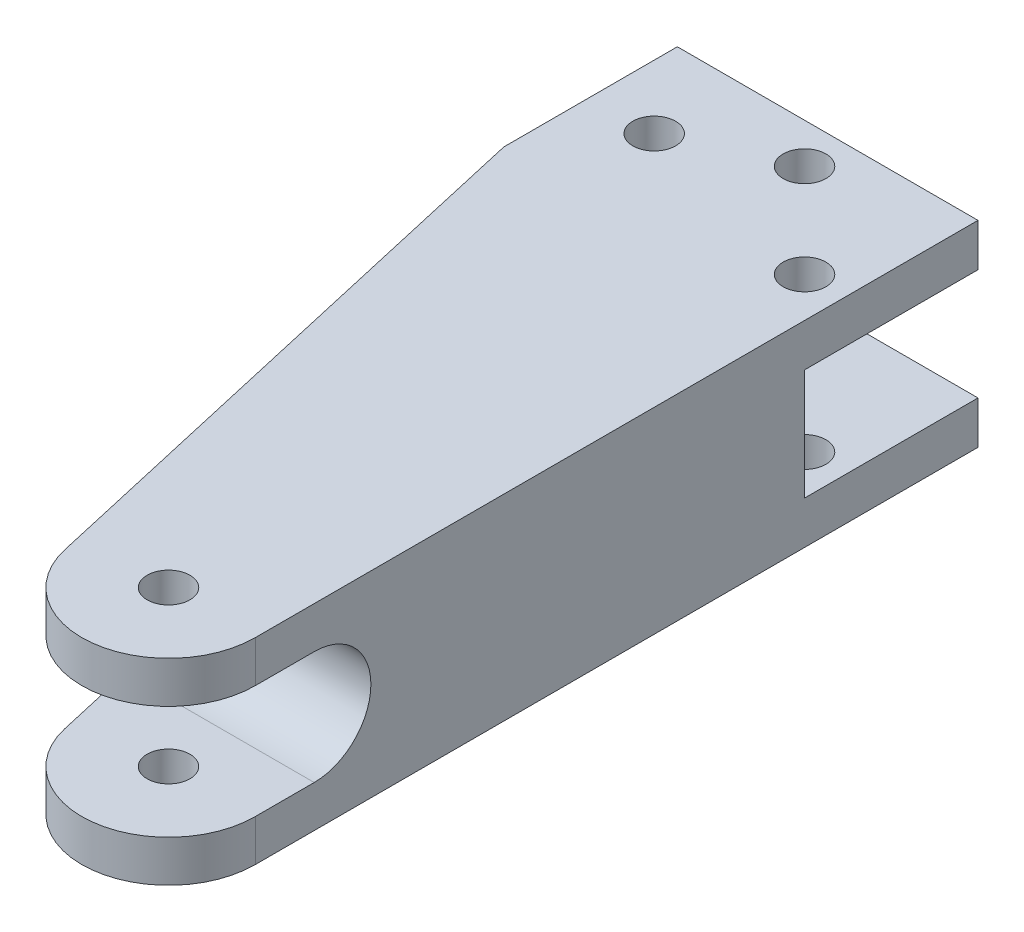
ISO-10303-21;
HEADER;
FILE_DESCRIPTION(('STEP AP214'),'2;1');
FILE_NAME('part.step','',(''),(''),'','','');
FILE_SCHEMA(('AUTOMOTIVE_DESIGN { 1 0 10303 214 1 1 1 1 }'));
ENDSEC;
DATA;
#1=APPLICATION_CONTEXT('core data for automotive mechanical design processes');
#2=APPLICATION_PROTOCOL_DEFINITION('international standard','automotive_design',2000,#1);
#3=PRODUCT_CONTEXT('',#1,'mechanical');
#4=PRODUCT('Part','Part','',(#3));
#5=PRODUCT_RELATED_PRODUCT_CATEGORY('part','',(#4));
#6=PRODUCT_DEFINITION_FORMATION('','',#4);
#7=PRODUCT_DEFINITION_CONTEXT('part definition',#1,'design');
#8=PRODUCT_DEFINITION('design','',#6,#7);
#9=PRODUCT_DEFINITION_SHAPE('','',#8);
#10=(LENGTH_UNIT() NAMED_UNIT(*) SI_UNIT(.MILLI.,.METRE.));
#11=(NAMED_UNIT(*) PLANE_ANGLE_UNIT() SI_UNIT($,.RADIAN.));
#12=(NAMED_UNIT(*) SI_UNIT($,.STERADIAN.) SOLID_ANGLE_UNIT());
#13=UNCERTAINTY_MEASURE_WITH_UNIT(LENGTH_MEASURE(1.E-05),#10,'distance_accuracy_value','');
#14=(GEOMETRIC_REPRESENTATION_CONTEXT(3) GLOBAL_UNCERTAINTY_ASSIGNED_CONTEXT((#13)) GLOBAL_UNIT_ASSIGNED_CONTEXT((#10,
#11,#12)) REPRESENTATION_CONTEXT('',''));
#15=CARTESIAN_POINT('',(0.,0.,0.));
#16=DIRECTION('',(0.,0.,1.));
#17=DIRECTION('',(1.,0.,0.));
#18=AXIS2_PLACEMENT_3D('',#15,#16,#17);
#19=CARTESIAN_POINT('',(0.,-78.105,79.375));
#20=DIRECTION('',(0.,1.,0.));
#21=DIRECTION('',(0.,0.,1.));
#22=AXIS2_PLACEMENT_3D('',#19,#20,#21);
#23=CYLINDRICAL_SURFACE('',#22,9.525);
#24=CARTESIAN_POINT('',(0.,-6.22300000000001,79.375));
#25=DIRECTION('',(0.,-1.,0.));
#26=DIRECTION('',(1.,0.,0.));
#27=AXIS2_PLACEMENT_3D('',#24,#25,#26);
#28=CIRCLE('',#27,9.525);
#29=CARTESIAN_POINT('',(-9.28759773629428,-6.223,81.4883275393988));
#30=VERTEX_POINT('',#29);
#31=CARTESIAN_POINT('',(9.525,-6.223,79.375));
#32=VERTEX_POINT('',#31);
#33=EDGE_CURVE('E184',#30,#32,#28,.F.);
#34=ORIENTED_EDGE('',*,*,#33,.F.);
#35=DIRECTION('',(0.,1.,0.));
#36=VECTOR('',#35,1.);
#37=CARTESIAN_POINT('',(-9.28759773629429,-93.5125785685914,81.4883275393988));
#38=LINE('',#37,#36);
#39=CARTESIAN_POINT('',(-9.28759773629429,-10.795,81.4883275393988));
#40=VERTEX_POINT('',#39);
#41=EDGE_CURVE('E214',#40,#30,#38,.T.);
#42=ORIENTED_EDGE('',*,*,#41,.F.);
#43=CARTESIAN_POINT('',(0.,-10.795,79.375));
#44=DIRECTION('',(0.,1.,0.));
#45=DIRECTION('',(0.,0.,1.));
#46=AXIS2_PLACEMENT_3D('',#43,#44,#45);
#47=CIRCLE('',#46,9.525);
#48=CARTESIAN_POINT('',(9.525,-10.795,79.375));
#49=VERTEX_POINT('',#48);
#50=EDGE_CURVE('E256',#40,#49,#47,.T.);
#51=ORIENTED_EDGE('',*,*,#50,.T.);
#52=DIRECTION('',(0.,1.,0.));
#53=VECTOR('',#52,1.);
#54=CARTESIAN_POINT('',(9.525,-78.105,79.375));
#55=LINE('',#54,#53);
#56=EDGE_CURVE('E253',#49,#32,#55,.T.);
#57=ORIENTED_EDGE('',*,*,#56,.T.);
#58=EDGE_LOOP('',(#34,#42,#51,#57));
#59=FACE_BOUND('',#58,.T.);
#60=ADVANCED_FACE('F39',(#59),#23,.T.);
#61=CARTESIAN_POINT('',(0.,0.,0.));
#62=DIRECTION('',(0.,0.,-1.));
#63=DIRECTION('',(-1.,0.,0.));
#64=AXIS2_PLACEMENT_3D('',#61,#62,#63);
#65=PLANE('',#64);
#66=DIRECTION('',(-1.,0.,0.));
#67=VECTOR('',#66,1.);
#68=CARTESIAN_POINT('',(0.,-6.096,0.));
#69=LINE('',#68,#67);
#70=CARTESIAN_POINT('',(9.525,-6.096,0.));
#71=VERTEX_POINT('',#70);
#72=CARTESIAN_POINT('',(-23.495,-6.096,0.));
#73=VERTEX_POINT('',#72);
#74=EDGE_CURVE('E204',#71,#73,#69,.T.);
#75=ORIENTED_EDGE('',*,*,#74,.F.);
#76=DIRECTION('',(0.,1.,0.));
#77=VECTOR('',#76,1.);
#78=CARTESIAN_POINT('',(9.525,-10.795,0.));
#79=LINE('',#78,#77);
#80=CARTESIAN_POINT('',(9.525,-10.795,0.));
#81=VERTEX_POINT('',#80);
#82=EDGE_CURVE('E262',#81,#71,#79,.T.);
#83=ORIENTED_EDGE('',*,*,#82,.F.);
#84=DIRECTION('',(1.,0.,0.));
#85=VECTOR('',#84,1.);
#86=CARTESIAN_POINT('',(-9.525,-10.795,0.));
#87=LINE('',#86,#85);
#88=CARTESIAN_POINT('',(-23.495,-10.795,0.));
#89=VERTEX_POINT('',#88);
#90=EDGE_CURVE('E258',#89,#81,#87,.T.);
#91=ORIENTED_EDGE('',*,*,#90,.F.);
#92=DIRECTION('',(0.,1.,0.));
#93=VECTOR('',#92,1.);
#94=CARTESIAN_POINT('',(-23.495,-93.5125785685914,0.));
#95=LINE('',#94,#93);
#96=EDGE_CURVE('E222',#89,#73,#95,.T.);
#97=ORIENTED_EDGE('',*,*,#96,.T.);
#98=EDGE_LOOP('',(#75,#83,#91,#97));
#99=FACE_BOUND('',#98,.T.);
#100=ADVANCED_FACE('F327',(#99),#65,.T.);
#101=CARTESIAN_POINT('',(-5.1435,-10.795,4.3815));
#102=DIRECTION('',(0.,1.,0.));
#103=DIRECTION('',(0.,0.,1.));
#104=AXIS2_PLACEMENT_3D('',#101,#102,#103);
#105=CYLINDRICAL_SURFACE('',#104,2.3495);
#106=CARTESIAN_POINT('',(-5.1435,-6.096,4.3815));
#107=DIRECTION('',(0.,-1.,0.));
#108=DIRECTION('',(1.,0.,0.));
#109=AXIS2_PLACEMENT_3D('',#106,#107,#108);
#110=CIRCLE('',#109,2.3495);
#111=CARTESIAN_POINT('',(-2.794,-6.096,4.3815));
#112=VERTEX_POINT('',#111);
#113=EDGE_CURVE('E201',#112,#112,#110,.F.);
#114=ORIENTED_EDGE('',*,*,#113,.T.);
#115=EDGE_LOOP('',(#114));
#116=FACE_BOUND('',#115,.T.);
#117=CARTESIAN_POINT('',(-5.1435,-10.795,4.3815));
#118=DIRECTION('',(0.,1.,0.));
#119=DIRECTION('',(0.,0.,1.));
#120=AXIS2_PLACEMENT_3D('',#117,#118,#119);
#121=CIRCLE('',#120,2.3495);
#122=CARTESIAN_POINT('',(-5.1435,-10.795,6.731));
#123=VERTEX_POINT('',#122);
#124=EDGE_CURVE('E248',#123,#123,#121,.T.);
#125=ORIENTED_EDGE('',*,*,#124,.F.);
#126=EDGE_LOOP('',(#125));
#127=FACE_BOUND('',#126,.T.);
#128=ADVANCED_FACE('F298',(#116,#127),#105,.F.);
#129=CARTESIAN_POINT('',(5.1435,-10.795,14.6685));
#130=DIRECTION('',(0.,1.,0.));
#131=DIRECTION('',(0.,0.,1.));
#132=AXIS2_PLACEMENT_3D('',#129,#130,#131);
#133=CYLINDRICAL_SURFACE('',#132,2.3495);
#134=CARTESIAN_POINT('',(5.1435,-6.096,14.6685));
#135=DIRECTION('',(0.,-1.,0.));
#136=DIRECTION('',(1.,0.,0.));
#137=AXIS2_PLACEMENT_3D('',#134,#135,#136);
#138=CIRCLE('',#137,2.3495);
#139=CARTESIAN_POINT('',(7.493,-6.096,14.6685));
#140=VERTEX_POINT('',#139);
#141=EDGE_CURVE('E198',#140,#140,#138,.F.);
#142=ORIENTED_EDGE('',*,*,#141,.T.);
#143=EDGE_LOOP('',(#142));
#144=FACE_BOUND('',#143,.T.);
#145=CARTESIAN_POINT('',(5.1435,-10.795,14.6685));
#146=DIRECTION('',(0.,1.,0.));
#147=DIRECTION('',(0.,0.,1.));
#148=AXIS2_PLACEMENT_3D('',#145,#146,#147);
#149=CIRCLE('',#148,2.3495);
#150=CARTESIAN_POINT('',(5.1435,-10.795,17.018));
#151=VERTEX_POINT('',#150);
#152=EDGE_CURVE('E242',#151,#151,#149,.T.);
#153=ORIENTED_EDGE('',*,*,#152,.F.);
#154=EDGE_LOOP('',(#153));
#155=FACE_BOUND('',#154,.T.);
#156=ADVANCED_FACE('F382',(#144,#155),#133,.F.);
#157=CARTESIAN_POINT('',(0.,-10.795,79.375));
#158=DIRECTION('',(0.,1.,0.));
#159=DIRECTION('',(0.,0.,1.));
#160=AXIS2_PLACEMENT_3D('',#157,#158,#159);
#161=CYLINDRICAL_SURFACE('',#160,2.3495);
#162=CARTESIAN_POINT('',(0.,-6.223,79.375));
#163=DIRECTION('',(0.,-1.,0.));
#164=DIRECTION('',(1.,0.,0.));
#165=AXIS2_PLACEMENT_3D('',#162,#163,#164);
#166=CIRCLE('',#165,2.3495);
#167=CARTESIAN_POINT('',(2.3495,-6.223,79.375));
#168=VERTEX_POINT('',#167);
#169=EDGE_CURVE('E186',#168,#168,#166,.F.);
#170=ORIENTED_EDGE('',*,*,#169,.T.);
#171=EDGE_LOOP('',(#170));
#172=FACE_BOUND('',#171,.T.);
#173=CARTESIAN_POINT('',(0.,-10.795,79.375));
#174=DIRECTION('',(0.,1.,0.));
#175=DIRECTION('',(0.,0.,1.));
#176=AXIS2_PLACEMENT_3D('',#173,#174,#175);
#177=CIRCLE('',#176,2.3495);
#178=CARTESIAN_POINT('',(0.,-10.795,81.7245));
#179=VERTEX_POINT('',#178);
#180=EDGE_CURVE('E236',#179,#179,#177,.T.);
#181=ORIENTED_EDGE('',*,*,#180,.F.);
#182=EDGE_LOOP('',(#181));
#183=FACE_BOUND('',#182,.T.);
#184=ADVANCED_FACE('F388',(#172,#183),#161,.F.);
#185=CARTESIAN_POINT('',(-23.495,-93.5125785685914,0.));
#186=DIRECTION('',(-1.,0.,0.));
#187=DIRECTION('',(0.,0.,1.));
#188=AXIS2_PLACEMENT_3D('',#185,#186,#187);
#189=PLANE('',#188);
#190=DIRECTION('',(0.,0.,-1.));
#191=VECTOR('',#190,1.);
#192=CARTESIAN_POINT('',(-23.495,-6.096,-19.05));
#193=LINE('',#192,#191);
#194=CARTESIAN_POINT('',(-23.495,-6.096,19.05));
#195=VERTEX_POINT('',#194);
#196=EDGE_CURVE('E56',#195,#73,#193,.T.);
#197=ORIENTED_EDGE('',*,*,#196,.T.);
#198=ORIENTED_EDGE('',*,*,#96,.F.);
#199=DIRECTION('',(0.,0.,-1.));
#200=VECTOR('',#199,1.);
#201=CARTESIAN_POINT('',(-23.495,-10.795,0.));
#202=LINE('',#201,#200);
#203=CARTESIAN_POINT('',(-23.495,-10.795,19.05));
#204=VERTEX_POINT('',#203);
#205=EDGE_CURVE('E210',#204,#89,#202,.T.);
#206=ORIENTED_EDGE('',*,*,#205,.F.);
#207=DIRECTION('',(0.,1.,0.));
#208=VECTOR('',#207,1.);
#209=CARTESIAN_POINT('',(-23.495,-93.5125785685914,19.05));
#210=LINE('',#209,#208);
#211=EDGE_CURVE('E231',#204,#195,#210,.T.);
#212=ORIENTED_EDGE('',*,*,#211,.T.);
#213=EDGE_LOOP('',(#197,#198,#206,#212));
#214=FACE_BOUND('',#213,.T.);
#215=ADVANCED_FACE('F321',(#214),#189,.T.);
#216=CARTESIAN_POINT('',(-16.51,-93.5125785685914,9.525));
#217=DIRECTION('',(0.,1.,0.));
#218=DIRECTION('',(0.,0.,1.));
#219=AXIS2_PLACEMENT_3D('',#216,#217,#218);
#220=CYLINDRICAL_SURFACE('',#219,2.3495);
#221=CARTESIAN_POINT('',(-16.51,-6.096,9.525));
#222=DIRECTION('',(0.,-1.,0.));
#223=DIRECTION('',(1.,0.,0.));
#224=AXIS2_PLACEMENT_3D('',#221,#222,#223);
#225=CIRCLE('',#224,2.3495);
#226=CARTESIAN_POINT('',(-14.1605,-6.096,9.525));
#227=VERTEX_POINT('',#226);
#228=EDGE_CURVE('E43',#227,#227,#225,.F.);
#229=ORIENTED_EDGE('',*,*,#228,.T.);
#230=EDGE_LOOP('',(#229));
#231=FACE_BOUND('',#230,.T.);
#232=CARTESIAN_POINT('',(-16.51,-10.795,9.525));
#233=DIRECTION('',(0.,1.,0.));
#234=DIRECTION('',(0.,0.,1.));
#235=AXIS2_PLACEMENT_3D('',#232,#233,#234);
#236=CIRCLE('',#235,2.3495);
#237=CARTESIAN_POINT('',(-16.51,-10.795,11.8745));
#238=VERTEX_POINT('',#237);
#239=EDGE_CURVE('E219',#238,#238,#236,.F.);
#240=ORIENTED_EDGE('',*,*,#239,.T.);
#241=EDGE_LOOP('',(#240));
#242=FACE_BOUND('',#241,.T.);
#243=ADVANCED_FACE('F311',(#231,#242),#220,.F.);
#244=CARTESIAN_POINT('',(0.,6.22299999999999,79.375));
#245=DIRECTION('',(0.,1.,0.));
#246=DIRECTION('',(-1.,0.,0.));
#247=AXIS2_PLACEMENT_3D('',#244,#245,#246);
#248=CIRCLE('',#247,9.525);
#249=CARTESIAN_POINT('',(9.525,6.223,79.375));
#250=VERTEX_POINT('',#249);
#251=CARTESIAN_POINT('',(-9.28759773629429,6.22299999999999,81.4883275393988));
#252=VERTEX_POINT('',#251);
#253=EDGE_CURVE('E64',#250,#252,#248,.F.);
#254=ORIENTED_EDGE('',*,*,#253,.F.);
#255=CARTESIAN_POINT('',(9.525,10.795,79.375));
#256=VERTEX_POINT('',#255);
#257=EDGE_CURVE('E157',#250,#256,#55,.T.);
#258=ORIENTED_EDGE('',*,*,#257,.T.);
#259=CARTESIAN_POINT('',(0.,10.795,79.375));
#260=DIRECTION('',(0.,1.,0.));
#261=DIRECTION('',(0.,0.,1.));
#262=AXIS2_PLACEMENT_3D('',#259,#260,#261);
#263=CIRCLE('',#262,9.525);
#264=CARTESIAN_POINT('',(-9.28759773629427,10.795,81.4883275393988));
#265=VERTEX_POINT('',#264);
#266=EDGE_CURVE('E273',#256,#265,#263,.F.);
#267=ORIENTED_EDGE('',*,*,#266,.T.);
#268=EDGE_CURVE('E218',#252,#265,#38,.T.);
#269=ORIENTED_EDGE('',*,*,#268,.F.);
#270=EDGE_LOOP('',(#254,#258,#267,#269));
#271=FACE_BOUND('',#270,.T.);
#272=ADVANCED_FACE('F324',(#271),#23,.T.);
#273=CARTESIAN_POINT('',(-9.525,-10.795,88.9));
#274=DIRECTION('',(0.,1.,0.));
#275=DIRECTION('',(0.,0.,1.));
#276=AXIS2_PLACEMENT_3D('',#273,#274,#275);
#277=PLANE('',#276);
#278=ORIENTED_EDGE('',*,*,#205,.T.);
#279=ORIENTED_EDGE('',*,*,#90,.T.);
#280=DIRECTION('',(0.,0.,-1.));
#281=VECTOR('',#280,1.);
#282=CARTESIAN_POINT('',(9.525,-10.795,88.9));
#283=LINE('',#282,#281);
#284=EDGE_CURVE('E271',#49,#81,#283,.T.);
#285=ORIENTED_EDGE('',*,*,#284,.F.);
#286=ORIENTED_EDGE('',*,*,#50,.F.);
#287=DIRECTION('',(-0.221871657679666,0.,-0.975075877826171));
#288=VECTOR('',#287,1.);
#289=CARTESIAN_POINT('',(-26.4597202830737,-10.795,6.02072324261971));
#290=LINE('',#289,#288);
#291=EDGE_CURVE('E223',#40,#204,#290,.T.);
#292=ORIENTED_EDGE('',*,*,#291,.T.);
#293=EDGE_LOOP('',(#278,#279,#285,#286,#292));
#294=FACE_BOUND('',#293,.T.);
#295=ORIENTED_EDGE('',*,*,#180,.T.);
#296=EDGE_LOOP('',(#295));
#297=FACE_BOUND('',#296,.T.);
#298=ORIENTED_EDGE('',*,*,#152,.T.);
#299=EDGE_LOOP('',(#298));
#300=FACE_BOUND('',#299,.T.);
#301=ORIENTED_EDGE('',*,*,#124,.T.);
#302=EDGE_LOOP('',(#301));
#303=FACE_BOUND('',#302,.T.);
#304=ORIENTED_EDGE('',*,*,#239,.F.);
#305=EDGE_LOOP('',(#304));
#306=FACE_BOUND('',#305,.T.);
#307=ADVANCED_FACE('F41',(#294,#297,#300,#303,#306),#277,.F.);
#308=CARTESIAN_POINT('',(9.525,-10.795,88.9));
#309=DIRECTION('',(-1.,0.,0.));
#310=DIRECTION('',(0.,-1.,0.));
#311=AXIS2_PLACEMENT_3D('',#308,#309,#310);
#312=PLANE('',#311);
#313=CARTESIAN_POINT('',(9.525,0.,72.898));
#314=DIRECTION('',(1.,0.,0.));
#315=DIRECTION('',(0.,-1.,0.));
#316=AXIS2_PLACEMENT_3D('',#313,#314,#315);
#317=CIRCLE('',#316,6.223);
#318=CARTESIAN_POINT('',(9.525,-6.223,72.898));
#319=VERTEX_POINT('',#318);
#320=CARTESIAN_POINT('',(9.525,6.223,72.898));
#321=VERTEX_POINT('',#320);
#322=EDGE_CURVE('E146',#319,#321,#317,.T.);
#323=ORIENTED_EDGE('',*,*,#322,.F.);
#324=DIRECTION('',(0.,0.,-1.));
#325=VECTOR('',#324,1.);
#326=CARTESIAN_POINT('',(9.525,-6.223,92.075));
#327=LINE('',#326,#325);
#328=EDGE_CURVE('E143',#32,#319,#327,.T.);
#329=ORIENTED_EDGE('',*,*,#328,.F.);
#330=ORIENTED_EDGE('',*,*,#56,.F.);
#331=ORIENTED_EDGE('',*,*,#284,.T.);
#332=ORIENTED_EDGE('',*,*,#82,.T.);
#333=DIRECTION('',(0.,0.,-1.));
#334=VECTOR('',#333,1.);
#335=CARTESIAN_POINT('',(9.525,-6.096,-19.05));
#336=LINE('',#335,#334);
#337=CARTESIAN_POINT('',(9.525,-6.096,19.05));
#338=VERTEX_POINT('',#337);
#339=EDGE_CURVE('E171',#338,#71,#336,.T.);
#340=ORIENTED_EDGE('',*,*,#339,.F.);
#341=DIRECTION('',(0.,-1.,0.));
#342=VECTOR('',#341,1.);
#343=CARTESIAN_POINT('',(9.525,-6.096,19.05));
#344=LINE('',#343,#342);
#345=CARTESIAN_POINT('',(9.525,6.096,19.05));
#346=VERTEX_POINT('',#345);
#347=EDGE_CURVE('E164',#346,#338,#344,.T.);
#348=ORIENTED_EDGE('',*,*,#347,.F.);
#349=DIRECTION('',(0.,0.,1.));
#350=VECTOR('',#349,1.);
#351=CARTESIAN_POINT('',(9.525,6.096,-19.05));
#352=LINE('',#351,#350);
#353=CARTESIAN_POINT('',(9.525,6.096,0.));
#354=VERTEX_POINT('',#353);
#355=EDGE_CURVE('E173',#354,#346,#352,.T.);
#356=ORIENTED_EDGE('',*,*,#355,.F.);
#357=CARTESIAN_POINT('',(9.525,10.795,0.));
#358=VERTEX_POINT('',#357);
#359=EDGE_CURVE('E261',#354,#358,#79,.T.);
#360=ORIENTED_EDGE('',*,*,#359,.T.);
#361=DIRECTION('',(0.,0.,-1.));
#362=VECTOR('',#361,1.);
#363=CARTESIAN_POINT('',(9.525,10.795,88.9));
#364=LINE('',#363,#362);
#365=EDGE_CURVE('E268',#256,#358,#364,.T.);
#366=ORIENTED_EDGE('',*,*,#365,.F.);
#367=ORIENTED_EDGE('',*,*,#257,.F.);
#368=DIRECTION('',(0.,0.,1.));
#369=VECTOR('',#368,1.);
#370=CARTESIAN_POINT('',(9.525,6.223,92.075));
#371=LINE('',#370,#369);
#372=EDGE_CURVE('E138',#321,#250,#371,.T.);
#373=ORIENTED_EDGE('',*,*,#372,.F.);
#374=EDGE_LOOP('',(#323,#329,#330,#331,#332,#340,#348,#356,#360,#366,#367,#373));
#375=FACE_BOUND('',#374,.T.);
#376=ADVANCED_FACE('F155',(#375),#312,.F.);
#377=CARTESIAN_POINT('',(-9.525,10.795,88.9));
#378=DIRECTION('',(0.,-1.,0.));
#379=DIRECTION('',(0.,0.,-1.));
#380=AXIS2_PLACEMENT_3D('',#377,#378,#379);
#381=PLANE('',#380);
#382=DIRECTION('',(-1.,0.,0.));
#383=VECTOR('',#382,1.);
#384=CARTESIAN_POINT('',(-9.525,10.795,0.));
#385=LINE('',#384,#383);
#386=CARTESIAN_POINT('',(-23.495,10.795,0.));
#387=VERTEX_POINT('',#386);
#388=EDGE_CURVE('E265',#358,#387,#385,.T.);
#389=ORIENTED_EDGE('',*,*,#388,.T.);
#390=DIRECTION('',(0.,0.,1.));
#391=VECTOR('',#390,1.);
#392=CARTESIAN_POINT('',(-23.495,10.795,0.));
#393=LINE('',#392,#391);
#394=CARTESIAN_POINT('',(-23.495,10.795,19.05));
#395=VERTEX_POINT('',#394);
#396=EDGE_CURVE('E211',#387,#395,#393,.T.);
#397=ORIENTED_EDGE('',*,*,#396,.T.);
#398=DIRECTION('',(0.221871657679666,0.,0.975075877826171));
#399=VECTOR('',#398,1.);
#400=CARTESIAN_POINT('',(-26.4597202830737,10.795,6.02072324261971));
#401=LINE('',#400,#399);
#402=EDGE_CURVE('E207',#395,#265,#401,.T.);
#403=ORIENTED_EDGE('',*,*,#402,.T.);
#404=ORIENTED_EDGE('',*,*,#266,.F.);
#405=ORIENTED_EDGE('',*,*,#365,.T.);
#406=EDGE_LOOP('',(#389,#397,#403,#404,#405));
#407=FACE_BOUND('',#406,.T.);
#408=CARTESIAN_POINT('',(0.,10.795,79.375));
#409=DIRECTION('',(0.,1.,0.));
#410=DIRECTION('',(0.,0.,1.));
#411=AXIS2_PLACEMENT_3D('',#408,#409,#410);
#412=CIRCLE('',#411,2.3495);
#413=CARTESIAN_POINT('',(0.,10.795,81.7245));
#414=VERTEX_POINT('',#413);
#415=EDGE_CURVE('E239',#414,#414,#412,.T.);
#416=ORIENTED_EDGE('',*,*,#415,.F.);
#417=EDGE_LOOP('',(#416));
#418=FACE_BOUND('',#417,.T.);
#419=CARTESIAN_POINT('',(5.1435,10.795,14.6685));
#420=DIRECTION('',(0.,1.,0.));
#421=DIRECTION('',(0.,0.,1.));
#422=AXIS2_PLACEMENT_3D('',#419,#420,#421);
#423=CIRCLE('',#422,2.3495);
#424=CARTESIAN_POINT('',(5.1435,10.795,17.018));
#425=VERTEX_POINT('',#424);
#426=EDGE_CURVE('E245',#425,#425,#423,.T.);
#427=ORIENTED_EDGE('',*,*,#426,.F.);
#428=EDGE_LOOP('',(#427));
#429=FACE_BOUND('',#428,.T.);
#430=CARTESIAN_POINT('',(-5.1435,10.795,4.3815));
#431=DIRECTION('',(0.,1.,0.));
#432=DIRECTION('',(0.,0.,1.));
#433=AXIS2_PLACEMENT_3D('',#430,#431,#432);
#434=CIRCLE('',#433,2.3495);
#435=CARTESIAN_POINT('',(-5.1435,10.795,6.731));
#436=VERTEX_POINT('',#435);
#437=EDGE_CURVE('E225',#436,#436,#434,.T.);
#438=ORIENTED_EDGE('',*,*,#437,.F.);
#439=EDGE_LOOP('',(#438));
#440=FACE_BOUND('',#439,.T.);
#441=CARTESIAN_POINT('',(-16.51,10.795,9.525));
#442=DIRECTION('',(0.,1.,0.));
#443=DIRECTION('',(0.,0.,1.));
#444=AXIS2_PLACEMENT_3D('',#441,#442,#443);
#445=CIRCLE('',#444,2.3495);
#446=CARTESIAN_POINT('',(-16.51,10.795,11.8745));
#447=VERTEX_POINT('',#446);
#448=EDGE_CURVE('E215',#447,#447,#445,.T.);
#449=ORIENTED_EDGE('',*,*,#448,.F.);
#450=EDGE_LOOP('',(#449));
#451=FACE_BOUND('',#450,.T.);
#452=ADVANCED_FACE('F301',(#407,#418,#429,#440,#451),#381,.F.);
#453=DIRECTION('',(1.,0.,0.));
#454=VECTOR('',#453,1.);
#455=CARTESIAN_POINT('',(0.,6.096,0.));
#456=LINE('',#455,#454);
#457=CARTESIAN_POINT('',(-23.495,6.096,0.));
#458=VERTEX_POINT('',#457);
#459=EDGE_CURVE('E196',#458,#354,#456,.T.);
#460=ORIENTED_EDGE('',*,*,#459,.F.);
#461=EDGE_CURVE('E228',#458,#387,#95,.T.);
#462=ORIENTED_EDGE('',*,*,#461,.T.);
#463=ORIENTED_EDGE('',*,*,#388,.F.);
#464=ORIENTED_EDGE('',*,*,#359,.F.);
#465=EDGE_LOOP('',(#460,#462,#463,#464));
#466=FACE_BOUND('',#465,.T.);
#467=ADVANCED_FACE('F296',(#466),#65,.T.);
#468=CARTESIAN_POINT('',(-5.1435,6.096,4.3815));
#469=DIRECTION('',(0.,1.,0.));
#470=DIRECTION('',(-1.,0.,0.));
#471=AXIS2_PLACEMENT_3D('',#468,#469,#470);
#472=CIRCLE('',#471,2.3495);
#473=CARTESIAN_POINT('',(-7.493,6.096,4.3815));
#474=VERTEX_POINT('',#473);
#475=EDGE_CURVE('E193',#474,#474,#472,.F.);
#476=ORIENTED_EDGE('',*,*,#475,.T.);
#477=EDGE_LOOP('',(#476));
#478=FACE_BOUND('',#477,.T.);
#479=ORIENTED_EDGE('',*,*,#437,.T.);
#480=EDGE_LOOP('',(#479));
#481=FACE_BOUND('',#480,.T.);
#482=ADVANCED_FACE('F292',(#478,#481),#105,.F.);
#483=CARTESIAN_POINT('',(5.1435,6.096,14.6685));
#484=DIRECTION('',(0.,1.,0.));
#485=DIRECTION('',(-1.,0.,0.));
#486=AXIS2_PLACEMENT_3D('',#483,#484,#485);
#487=CIRCLE('',#486,2.3495);
#488=CARTESIAN_POINT('',(2.794,6.096,14.6685));
#489=VERTEX_POINT('',#488);
#490=EDGE_CURVE('E190',#489,#489,#487,.F.);
#491=ORIENTED_EDGE('',*,*,#490,.T.);
#492=EDGE_LOOP('',(#491));
#493=FACE_BOUND('',#492,.T.);
#494=ORIENTED_EDGE('',*,*,#426,.T.);
#495=EDGE_LOOP('',(#494));
#496=FACE_BOUND('',#495,.T.);
#497=ADVANCED_FACE('F295',(#493,#496),#133,.F.);
#498=CARTESIAN_POINT('',(0.,6.22299999999999,79.375));
#499=DIRECTION('',(0.,1.,0.));
#500=DIRECTION('',(-1.,0.,0.));
#501=AXIS2_PLACEMENT_3D('',#498,#499,#500);
#502=CIRCLE('',#501,2.3495);
#503=CARTESIAN_POINT('',(-2.3495,6.22299999999999,79.375));
#504=VERTEX_POINT('',#503);
#505=EDGE_CURVE('E181',#504,#504,#502,.F.);
#506=ORIENTED_EDGE('',*,*,#505,.T.);
#507=EDGE_LOOP('',(#506));
#508=FACE_BOUND('',#507,.T.);
#509=ORIENTED_EDGE('',*,*,#415,.T.);
#510=EDGE_LOOP('',(#509));
#511=FACE_BOUND('',#510,.T.);
#512=ADVANCED_FACE('F318',(#508,#511),#161,.F.);
#513=DIRECTION('',(0.,0.,1.));
#514=VECTOR('',#513,1.);
#515=CARTESIAN_POINT('',(-23.495,6.096,-19.05));
#516=LINE('',#515,#514);
#517=CARTESIAN_POINT('',(-23.495,6.096,19.05));
#518=VERTEX_POINT('',#517);
#519=EDGE_CURVE('E163',#458,#518,#516,.T.);
#520=ORIENTED_EDGE('',*,*,#519,.T.);
#521=EDGE_CURVE('E206',#518,#395,#210,.T.);
#522=ORIENTED_EDGE('',*,*,#521,.T.);
#523=ORIENTED_EDGE('',*,*,#396,.F.);
#524=ORIENTED_EDGE('',*,*,#461,.F.);
#525=EDGE_LOOP('',(#520,#522,#523,#524));
#526=FACE_BOUND('',#525,.T.);
#527=ADVANCED_FACE('F309',(#526),#189,.T.);
#528=CARTESIAN_POINT('',(-16.51,6.09599999999999,9.525));
#529=DIRECTION('',(0.,1.,0.));
#530=DIRECTION('',(-1.,0.,0.));
#531=AXIS2_PLACEMENT_3D('',#528,#529,#530);
#532=CIRCLE('',#531,2.3495);
#533=CARTESIAN_POINT('',(-18.8595,6.09599999999999,9.525));
#534=VERTEX_POINT('',#533);
#535=EDGE_CURVE('E189',#534,#534,#532,.F.);
#536=ORIENTED_EDGE('',*,*,#535,.T.);
#537=EDGE_LOOP('',(#536));
#538=FACE_BOUND('',#537,.T.);
#539=ORIENTED_EDGE('',*,*,#448,.T.);
#540=EDGE_LOOP('',(#539));
#541=FACE_BOUND('',#540,.T.);
#542=ADVANCED_FACE('F280',(#538,#541),#220,.F.);
#543=CARTESIAN_POINT('',(-26.4597202830737,-93.5125785685914,6.02072324261971));
#544=DIRECTION('',(-0.975075877826171,0.,0.221871657679666));
#545=DIRECTION('',(0.221871657679666,0.,0.975075877826171));
#546=AXIS2_PLACEMENT_3D('',#543,#544,#545);
#547=PLANE('',#546);
#548=DIRECTION('',(0.221871657679666,0.,0.975075877826171));
#549=VECTOR('',#548,1.);
#550=CARTESIAN_POINT('',(-26.4597202830737,-6.22300000000001,6.02072324261971));
#551=LINE('',#550,#549);
#552=CARTESIAN_POINT('',(-11.2422663467278,-6.223,72.898));
#553=VERTEX_POINT('',#552);
#554=EDGE_CURVE('E11',#553,#30,#551,.T.);
#555=ORIENTED_EDGE('',*,*,#554,.F.);
#556=CARTESIAN_POINT('',(-11.2422663467278,0.,72.898));
#557=DIRECTION('',(-0.975075877826171,0.,0.221871657679666));
#558=DIRECTION('',(0.221871657679666,0.,0.975075877826171));
#559=AXIS2_PLACEMENT_3D('',#556,#557,#558);
#560=ELLIPSE('',#559,6.38206742830468,6.223);
#561=CARTESIAN_POINT('',(-11.2422663467278,6.22299999999999,72.898));
#562=VERTEX_POINT('',#561);
#563=EDGE_CURVE('E48',#562,#553,#560,.T.);
#564=ORIENTED_EDGE('',*,*,#563,.F.);
#565=DIRECTION('',(-0.221871657679666,0.,-0.975075877826171));
#566=VECTOR('',#565,1.);
#567=CARTESIAN_POINT('',(-26.4597202830737,6.22299999999999,6.02072324261971));
#568=LINE('',#567,#566);
#569=EDGE_CURVE('E139',#252,#562,#568,.T.);
#570=ORIENTED_EDGE('',*,*,#569,.F.);
#571=ORIENTED_EDGE('',*,*,#268,.T.);
#572=ORIENTED_EDGE('',*,*,#402,.F.);
#573=ORIENTED_EDGE('',*,*,#521,.F.);
#574=DIRECTION('',(0.,-1.,0.));
#575=VECTOR('',#574,1.);
#576=CARTESIAN_POINT('',(-23.495,-6.096,19.05));
#577=LINE('',#576,#575);
#578=EDGE_CURVE('E167',#518,#195,#577,.T.);
#579=ORIENTED_EDGE('',*,*,#578,.T.);
#580=ORIENTED_EDGE('',*,*,#211,.F.);
#581=ORIENTED_EDGE('',*,*,#291,.F.);
#582=ORIENTED_EDGE('',*,*,#41,.T.);
#583=EDGE_LOOP('',(#555,#564,#570,#571,#572,#573,#579,#580,#581,#582));
#584=FACE_BOUND('',#583,.T.);
#585=ADVANCED_FACE('F308',(#584),#547,.T.);
#586=CARTESIAN_POINT('',(-23.495,-6.096,-19.05));
#587=DIRECTION('',(0.,-1.,0.));
#588=DIRECTION('',(1.,0.,0.));
#589=AXIS2_PLACEMENT_3D('',#586,#587,#588);
#590=PLANE('',#589);
#591=ORIENTED_EDGE('',*,*,#74,.T.);
#592=ORIENTED_EDGE('',*,*,#196,.F.);
#593=DIRECTION('',(1.,0.,0.));
#594=VECTOR('',#593,1.);
#595=CARTESIAN_POINT('',(-23.495,-6.096,19.05));
#596=LINE('',#595,#594);
#597=EDGE_CURVE('E152',#195,#338,#596,.T.);
#598=ORIENTED_EDGE('',*,*,#597,.T.);
#599=ORIENTED_EDGE('',*,*,#339,.T.);
#600=EDGE_LOOP('',(#591,#592,#598,#599));
#601=FACE_BOUND('',#600,.T.);
#602=ORIENTED_EDGE('',*,*,#141,.F.);
#603=EDGE_LOOP('',(#602));
#604=FACE_BOUND('',#603,.T.);
#605=ORIENTED_EDGE('',*,*,#228,.F.);
#606=EDGE_LOOP('',(#605));
#607=FACE_BOUND('',#606,.T.);
#608=ORIENTED_EDGE('',*,*,#113,.F.);
#609=EDGE_LOOP('',(#608));
#610=FACE_BOUND('',#609,.T.);
#611=ADVANCED_FACE('F287',(#601,#604,#607,#610),#590,.F.);
#612=CARTESIAN_POINT('',(-23.495,6.096,-19.05));
#613=DIRECTION('',(0.,1.,0.));
#614=DIRECTION('',(-1.,0.,0.));
#615=AXIS2_PLACEMENT_3D('',#612,#613,#614);
#616=PLANE('',#615);
#617=ORIENTED_EDGE('',*,*,#459,.T.);
#618=ORIENTED_EDGE('',*,*,#355,.T.);
#619=DIRECTION('',(1.,0.,0.));
#620=VECTOR('',#619,1.);
#621=CARTESIAN_POINT('',(-23.495,6.096,19.05));
#622=LINE('',#621,#620);
#623=EDGE_CURVE('E170',#518,#346,#622,.T.);
#624=ORIENTED_EDGE('',*,*,#623,.F.);
#625=ORIENTED_EDGE('',*,*,#519,.F.);
#626=EDGE_LOOP('',(#617,#618,#624,#625));
#627=FACE_BOUND('',#626,.T.);
#628=ORIENTED_EDGE('',*,*,#490,.F.);
#629=EDGE_LOOP('',(#628));
#630=FACE_BOUND('',#629,.T.);
#631=ORIENTED_EDGE('',*,*,#535,.F.);
#632=EDGE_LOOP('',(#631));
#633=FACE_BOUND('',#632,.T.);
#634=ORIENTED_EDGE('',*,*,#475,.F.);
#635=EDGE_LOOP('',(#634));
#636=FACE_BOUND('',#635,.T.);
#637=ADVANCED_FACE('F283',(#627,#630,#633,#636),#616,.F.);
#638=CARTESIAN_POINT('',(-23.495,-6.096,19.05));
#639=DIRECTION('',(0.,0.,1.));
#640=DIRECTION('',(0.,-1.,0.));
#641=AXIS2_PLACEMENT_3D('',#638,#639,#640);
#642=PLANE('',#641);
#643=ORIENTED_EDGE('',*,*,#347,.T.);
#644=ORIENTED_EDGE('',*,*,#597,.F.);
#645=ORIENTED_EDGE('',*,*,#578,.F.);
#646=ORIENTED_EDGE('',*,*,#623,.T.);
#647=EDGE_LOOP('',(#643,#644,#645,#646));
#648=FACE_BOUND('',#647,.T.);
#649=ADVANCED_FACE('F286',(#648),#642,.F.);
#650=CARTESIAN_POINT('',(-23.495,-6.22300000000001,92.075));
#651=DIRECTION('',(0.,-1.,0.));
#652=DIRECTION('',(1.,0.,0.));
#653=AXIS2_PLACEMENT_3D('',#650,#651,#652);
#654=PLANE('',#653);
#655=ORIENTED_EDGE('',*,*,#33,.T.);
#656=ORIENTED_EDGE('',*,*,#328,.T.);
#657=DIRECTION('',(1.,0.,0.));
#658=VECTOR('',#657,1.);
#659=CARTESIAN_POINT('',(-23.495,-6.22300000000001,72.898));
#660=LINE('',#659,#658);
#661=EDGE_CURVE('E142',#553,#319,#660,.T.);
#662=ORIENTED_EDGE('',*,*,#661,.F.);
#663=ORIENTED_EDGE('',*,*,#554,.T.);
#664=EDGE_LOOP('',(#655,#656,#662,#663));
#665=FACE_BOUND('',#664,.T.);
#666=ORIENTED_EDGE('',*,*,#169,.F.);
#667=EDGE_LOOP('',(#666));
#668=FACE_BOUND('',#667,.T.);
#669=ADVANCED_FACE('F348',(#665,#668),#654,.F.);
#670=CARTESIAN_POINT('',(-23.495,6.22299999999999,92.075));
#671=DIRECTION('',(0.,1.,0.));
#672=DIRECTION('',(-1.,0.,0.));
#673=AXIS2_PLACEMENT_3D('',#670,#671,#672);
#674=PLANE('',#673);
#675=ORIENTED_EDGE('',*,*,#253,.T.);
#676=ORIENTED_EDGE('',*,*,#569,.T.);
#677=DIRECTION('',(1.,0.,0.));
#678=VECTOR('',#677,1.);
#679=CARTESIAN_POINT('',(-23.495,6.22299999999999,72.898));
#680=LINE('',#679,#678);
#681=EDGE_CURVE('E133',#562,#321,#680,.T.);
#682=ORIENTED_EDGE('',*,*,#681,.T.);
#683=ORIENTED_EDGE('',*,*,#372,.T.);
#684=EDGE_LOOP('',(#675,#676,#682,#683));
#685=FACE_BOUND('',#684,.T.);
#686=ORIENTED_EDGE('',*,*,#505,.F.);
#687=EDGE_LOOP('',(#686));
#688=FACE_BOUND('',#687,.T.);
#689=ADVANCED_FACE('F135',(#685,#688),#674,.F.);
#690=CARTESIAN_POINT('',(-23.495,0.,72.898));
#691=DIRECTION('',(1.,0.,0.));
#692=DIRECTION('',(0.,1.,0.));
#693=AXIS2_PLACEMENT_3D('',#690,#691,#692);
#694=CYLINDRICAL_SURFACE('',#693,6.223);
#695=ORIENTED_EDGE('',*,*,#563,.T.);
#696=ORIENTED_EDGE('',*,*,#661,.T.);
#697=ORIENTED_EDGE('',*,*,#322,.T.);
#698=ORIENTED_EDGE('',*,*,#681,.F.);
#699=EDGE_LOOP('',(#695,#696,#697,#698));
#700=FACE_BOUND('',#699,.T.);
#701=ADVANCED_FACE('F147',(#700),#694,.F.);
#702=CLOSED_SHELL('',(#60,#100,#128,#156,#184,#215,#243,#272,#307,#376,#452,#467,#482,#497,#512,
#527,#542,#585,#611,#637,#649,#669,#689,#701));
#703=MANIFOLD_SOLID_BREP('B2',#702);
#704=ADVANCED_BREP_SHAPE_REPRESENTATION('',(#18,#703),#14);
#705=SHAPE_DEFINITION_REPRESENTATION(#9,#704);
ENDSEC;
END-ISO-10303-21;
